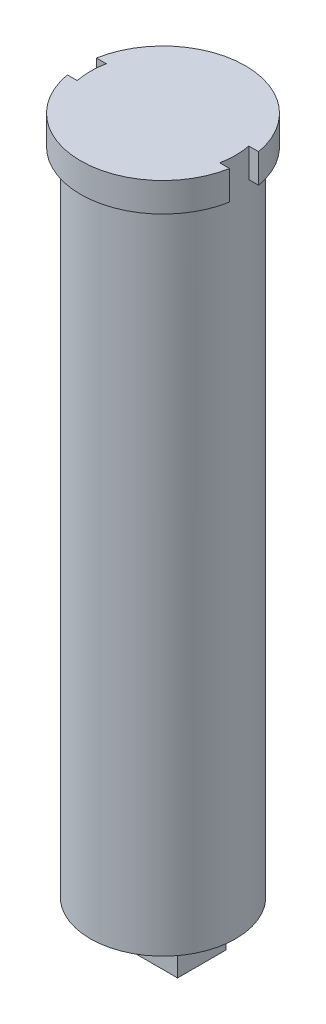
ISO-10303-21;
HEADER;
FILE_DESCRIPTION(('STEP AP214'),'2;1');
FILE_NAME('part.step','',(''),(''),'','','');
FILE_SCHEMA(('AUTOMOTIVE_DESIGN { 1 0 10303 214 1 1 1 1 }'));
ENDSEC;
DATA;
#1=APPLICATION_CONTEXT('core data for automotive mechanical design processes');
#2=APPLICATION_PROTOCOL_DEFINITION('international standard','automotive_design',2000,#1);
#3=PRODUCT_CONTEXT('',#1,'mechanical');
#4=PRODUCT('Part','Part','',(#3));
#5=PRODUCT_RELATED_PRODUCT_CATEGORY('part','',(#4));
#6=PRODUCT_DEFINITION_FORMATION('','',#4);
#7=PRODUCT_DEFINITION_CONTEXT('part definition',#1,'design');
#8=PRODUCT_DEFINITION('design','',#6,#7);
#9=PRODUCT_DEFINITION_SHAPE('','',#8);
#10=(LENGTH_UNIT() NAMED_UNIT(*) SI_UNIT(.MILLI.,.METRE.));
#11=(NAMED_UNIT(*) PLANE_ANGLE_UNIT() SI_UNIT($,.RADIAN.));
#12=(NAMED_UNIT(*) SI_UNIT($,.STERADIAN.) SOLID_ANGLE_UNIT());
#13=UNCERTAINTY_MEASURE_WITH_UNIT(LENGTH_MEASURE(1.E-05),#10,'distance_accuracy_value','');
#14=(GEOMETRIC_REPRESENTATION_CONTEXT(3) GLOBAL_UNCERTAINTY_ASSIGNED_CONTEXT((#13)) GLOBAL_UNIT_ASSIGNED_CONTEXT((#10,
#11,#12)) REPRESENTATION_CONTEXT('',''));
#15=CARTESIAN_POINT('',(0.,0.,0.));
#16=DIRECTION('',(0.,0.,1.));
#17=DIRECTION('',(1.,0.,0.));
#18=AXIS2_PLACEMENT_3D('',#15,#16,#17);
#19=CARTESIAN_POINT('',(0.,0.,0.));
#20=DIRECTION('',(0.,1.,0.));
#21=DIRECTION('',(0.,0.,1.));
#22=AXIS2_PLACEMENT_3D('',#19,#20,#21);
#23=PLANE('',#22);
#24=DIRECTION('',(1.,0.,0.));
#25=VECTOR('',#24,1.);
#26=CARTESIAN_POINT('',(7.34846922834953,0.,-1.5));
#27=LINE('',#26,#25);
#28=CARTESIAN_POINT('',(7.34846922834953,0.,-1.5));
#29=VERTEX_POINT('',#28);
#30=CARTESIAN_POINT('',(8.36660026534076,0.,-1.5));
#31=VERTEX_POINT('',#30);
#32=EDGE_CURVE('E172',#29,#31,#27,.T.);
#33=ORIENTED_EDGE('',*,*,#32,.F.);
#34=CARTESIAN_POINT('',(0.,0.,0.));
#35=DIRECTION('',(0.,1.,0.));
#36=DIRECTION('',(0.,0.,1.));
#37=AXIS2_PLACEMENT_3D('',#34,#35,#36);
#38=CIRCLE('',#37,7.5);
#39=CARTESIAN_POINT('',(-7.34846922834953,0.,-1.5));
#40=VERTEX_POINT('',#39);
#41=EDGE_CURVE('E11',#29,#40,#38,.T.);
#42=ORIENTED_EDGE('',*,*,#41,.T.);
#43=DIRECTION('',(1.,0.,0.));
#44=VECTOR('',#43,1.);
#45=CARTESIAN_POINT('',(-8.36660026534076,0.,-1.5));
#46=LINE('',#45,#44);
#47=CARTESIAN_POINT('',(-8.36660026534076,0.,-1.5));
#48=VERTEX_POINT('',#47);
#49=EDGE_CURVE('E189',#48,#40,#46,.T.);
#50=ORIENTED_EDGE('',*,*,#49,.F.);
#51=CARTESIAN_POINT('',(0.,0.,0.));
#52=DIRECTION('',(0.,1.,0.));
#53=DIRECTION('',(0.,0.,1.));
#54=AXIS2_PLACEMENT_3D('',#51,#52,#53);
#55=CIRCLE('',#54,8.5);
#56=EDGE_CURVE('E166',#31,#48,#55,.T.);
#57=ORIENTED_EDGE('',*,*,#56,.F.);
#58=EDGE_LOOP('',(#33,#42,#50,#57));
#59=FACE_BOUND('',#58,.T.);
#60=ADVANCED_FACE('F38',(#59),#23,.F.);
#61=CARTESIAN_POINT('',(0.,3.,0.));
#62=DIRECTION('',(0.,-1.,0.));
#63=DIRECTION('',(0.,0.,-1.));
#64=AXIS2_PLACEMENT_3D('',#61,#62,#63);
#65=CYLINDRICAL_SURFACE('',#64,8.5);
#66=ORIENTED_EDGE('',*,*,#56,.T.);
#67=DIRECTION('',(0.,-1.,0.));
#68=VECTOR('',#67,1.);
#69=CARTESIAN_POINT('',(-8.36660026534076,3.,-1.5));
#70=LINE('',#69,#68);
#71=CARTESIAN_POINT('',(-8.36660026534076,3.,-1.5));
#72=VERTEX_POINT('',#71);
#73=EDGE_CURVE('E42',#72,#48,#70,.T.);
#74=ORIENTED_EDGE('',*,*,#73,.F.);
#75=CARTESIAN_POINT('',(0.,3.,0.));
#76=DIRECTION('',(0.,1.,0.));
#77=DIRECTION('',(0.,0.,1.));
#78=AXIS2_PLACEMENT_3D('',#75,#76,#77);
#79=CIRCLE('',#78,8.5);
#80=CARTESIAN_POINT('',(8.36660026534076,3.,-1.5));
#81=VERTEX_POINT('',#80);
#82=EDGE_CURVE('E168',#81,#72,#79,.T.);
#83=ORIENTED_EDGE('',*,*,#82,.F.);
#84=DIRECTION('',(0.,-1.,0.));
#85=VECTOR('',#84,1.);
#86=CARTESIAN_POINT('',(8.36660026534076,3.,-1.5));
#87=LINE('',#86,#85);
#88=EDGE_CURVE('E186',#81,#31,#87,.T.);
#89=ORIENTED_EDGE('',*,*,#88,.T.);
#90=EDGE_LOOP('',(#66,#74,#83,#89));
#91=FACE_BOUND('',#90,.T.);
#92=ADVANCED_FACE('F40',(#91),#65,.T.);
#93=CARTESIAN_POINT('',(-8.36660026534076,3.,-1.5));
#94=DIRECTION('',(0.,0.,-1.));
#95=DIRECTION('',(-1.,0.,0.));
#96=AXIS2_PLACEMENT_3D('',#93,#94,#95);
#97=PLANE('',#96);
#98=ORIENTED_EDGE('',*,*,#49,.T.);
#99=DIRECTION('',(0.,-1.,0.));
#100=VECTOR('',#99,1.);
#101=CARTESIAN_POINT('',(-7.34846922834953,3.,-1.5));
#102=LINE('',#101,#100);
#103=CARTESIAN_POINT('',(-7.34846922834953,3.,-1.5));
#104=VERTEX_POINT('',#103);
#105=EDGE_CURVE('E216',#104,#40,#102,.T.);
#106=ORIENTED_EDGE('',*,*,#105,.F.);
#107=DIRECTION('',(1.,0.,0.));
#108=VECTOR('',#107,1.);
#109=CARTESIAN_POINT('',(-8.36660026534076,3.,-1.5));
#110=LINE('',#109,#108);
#111=EDGE_CURVE('E171',#72,#104,#110,.T.);
#112=ORIENTED_EDGE('',*,*,#111,.F.);
#113=ORIENTED_EDGE('',*,*,#73,.T.);
#114=EDGE_LOOP('',(#98,#106,#112,#113));
#115=FACE_BOUND('',#114,.T.);
#116=ADVANCED_FACE('F250',(#115),#97,.F.);
#117=CARTESIAN_POINT('',(-8.36660026534076,3.,1.5));
#118=DIRECTION('',(0.,0.,1.));
#119=DIRECTION('',(1.,0.,0.));
#120=AXIS2_PLACEMENT_3D('',#117,#118,#119);
#121=PLANE('',#120);
#122=DIRECTION('',(-1.,0.,0.));
#123=VECTOR('',#122,1.);
#124=CARTESIAN_POINT('',(-8.36660026534076,0.,1.5));
#125=LINE('',#124,#123);
#126=CARTESIAN_POINT('',(-7.34846922834953,0.,1.5));
#127=VERTEX_POINT('',#126);
#128=CARTESIAN_POINT('',(-8.36660026534076,0.,1.5));
#129=VERTEX_POINT('',#128);
#130=EDGE_CURVE('E192',#127,#129,#125,.T.);
#131=ORIENTED_EDGE('',*,*,#130,.T.);
#132=DIRECTION('',(0.,-1.,0.));
#133=VECTOR('',#132,1.);
#134=CARTESIAN_POINT('',(-8.36660026534076,3.,1.5));
#135=LINE('',#134,#133);
#136=CARTESIAN_POINT('',(-8.36660026534076,3.,1.5));
#137=VERTEX_POINT('',#136);
#138=EDGE_CURVE('E211',#137,#129,#135,.T.);
#139=ORIENTED_EDGE('',*,*,#138,.F.);
#140=DIRECTION('',(-1.,0.,0.));
#141=VECTOR('',#140,1.);
#142=CARTESIAN_POINT('',(-8.36660026534076,3.,1.5));
#143=LINE('',#142,#141);
#144=CARTESIAN_POINT('',(-7.34846922834954,3.,1.5));
#145=VERTEX_POINT('',#144);
#146=EDGE_CURVE('E176',#145,#137,#143,.T.);
#147=ORIENTED_EDGE('',*,*,#146,.F.);
#148=DIRECTION('',(0.,-1.,0.));
#149=VECTOR('',#148,1.);
#150=CARTESIAN_POINT('',(-7.34846922834954,3.,1.5));
#151=LINE('',#150,#149);
#152=EDGE_CURVE('E214',#145,#127,#151,.T.);
#153=ORIENTED_EDGE('',*,*,#152,.T.);
#154=EDGE_LOOP('',(#131,#139,#147,#153));
#155=FACE_BOUND('',#154,.T.);
#156=ADVANCED_FACE('F248',(#155),#121,.F.);
#157=CARTESIAN_POINT('',(0.,3.,0.));
#158=DIRECTION('',(0.,-1.,0.));
#159=DIRECTION('',(0.,0.,-1.));
#160=AXIS2_PLACEMENT_3D('',#157,#158,#159);
#161=CYLINDRICAL_SURFACE('',#160,8.5);
#162=CARTESIAN_POINT('',(0.,0.,0.));
#163=DIRECTION('',(0.,1.,0.));
#164=DIRECTION('',(0.,0.,1.));
#165=AXIS2_PLACEMENT_3D('',#162,#163,#164);
#166=CIRCLE('',#165,8.5);
#167=CARTESIAN_POINT('',(8.36660026534076,0.,1.5));
#168=VERTEX_POINT('',#167);
#169=EDGE_CURVE('E194',#129,#168,#166,.T.);
#170=ORIENTED_EDGE('',*,*,#169,.T.);
#171=DIRECTION('',(0.,-1.,0.));
#172=VECTOR('',#171,1.);
#173=CARTESIAN_POINT('',(8.36660026534076,3.,1.5));
#174=LINE('',#173,#172);
#175=CARTESIAN_POINT('',(8.36660026534076,3.,1.5));
#176=VERTEX_POINT('',#175);
#177=EDGE_CURVE('E208',#176,#168,#174,.T.);
#178=ORIENTED_EDGE('',*,*,#177,.F.);
#179=CARTESIAN_POINT('',(0.,3.,0.));
#180=DIRECTION('',(0.,1.,0.));
#181=DIRECTION('',(0.,0.,1.));
#182=AXIS2_PLACEMENT_3D('',#179,#180,#181);
#183=CIRCLE('',#182,8.5);
#184=EDGE_CURVE('E178',#137,#176,#183,.T.);
#185=ORIENTED_EDGE('',*,*,#184,.F.);
#186=ORIENTED_EDGE('',*,*,#138,.T.);
#187=EDGE_LOOP('',(#170,#178,#185,#186));
#188=FACE_BOUND('',#187,.T.);
#189=ADVANCED_FACE('F246',(#188),#161,.T.);
#190=CARTESIAN_POINT('',(7.34846922834953,3.,1.5));
#191=DIRECTION('',(0.,0.,1.));
#192=DIRECTION('',(1.,0.,0.));
#193=AXIS2_PLACEMENT_3D('',#190,#191,#192);
#194=PLANE('',#193);
#195=DIRECTION('',(-1.,0.,0.));
#196=VECTOR('',#195,1.);
#197=CARTESIAN_POINT('',(7.34846922834953,0.,1.5));
#198=LINE('',#197,#196);
#199=CARTESIAN_POINT('',(7.34846922834953,0.,1.5));
#200=VERTEX_POINT('',#199);
#201=EDGE_CURVE('E196',#168,#200,#198,.T.);
#202=ORIENTED_EDGE('',*,*,#201,.T.);
#203=DIRECTION('',(0.,-1.,0.));
#204=VECTOR('',#203,1.);
#205=CARTESIAN_POINT('',(7.34846922834953,3.,1.5));
#206=LINE('',#205,#204);
#207=CARTESIAN_POINT('',(7.34846922834953,3.,1.5));
#208=VERTEX_POINT('',#207);
#209=EDGE_CURVE('E205',#208,#200,#206,.T.);
#210=ORIENTED_EDGE('',*,*,#209,.F.);
#211=DIRECTION('',(-1.,0.,0.));
#212=VECTOR('',#211,1.);
#213=CARTESIAN_POINT('',(7.34846922834953,3.,1.5));
#214=LINE('',#213,#212);
#215=EDGE_CURVE('E180',#176,#208,#214,.T.);
#216=ORIENTED_EDGE('',*,*,#215,.F.);
#217=ORIENTED_EDGE('',*,*,#177,.T.);
#218=EDGE_LOOP('',(#202,#210,#216,#217));
#219=FACE_BOUND('',#218,.T.);
#220=ADVANCED_FACE('F232',(#219),#194,.F.);
#221=CARTESIAN_POINT('',(0.,3.,0.));
#222=DIRECTION('',(0.,-1.,0.));
#223=DIRECTION('',(0.,0.,-1.));
#224=AXIS2_PLACEMENT_3D('',#221,#222,#223);
#225=CYLINDRICAL_SURFACE('',#224,7.5);
#226=CARTESIAN_POINT('',(0.,-67.,0.));
#227=DIRECTION('',(0.,1.,0.));
#228=DIRECTION('',(0.,0.,1.));
#229=AXIS2_PLACEMENT_3D('',#226,#227,#228);
#230=CIRCLE('',#229,7.5);
#231=CARTESIAN_POINT('',(0.,-67.,7.5));
#232=VERTEX_POINT('',#231);
#233=EDGE_CURVE('E135',#232,#232,#230,.T.);
#234=ORIENTED_EDGE('',*,*,#233,.T.);
#235=EDGE_LOOP('',(#234));
#236=FACE_BOUND('',#235,.T.);
#237=ORIENTED_EDGE('',*,*,#209,.T.);
#238=EDGE_CURVE('E47',#127,#200,#38,.T.);
#239=ORIENTED_EDGE('',*,*,#238,.F.);
#240=ORIENTED_EDGE('',*,*,#152,.F.);
#241=CARTESIAN_POINT('',(0.,3.,0.));
#242=DIRECTION('',(0.,1.,0.));
#243=DIRECTION('',(0.,0.,1.));
#244=AXIS2_PLACEMENT_3D('',#241,#242,#243);
#245=CIRCLE('',#244,7.5);
#246=EDGE_CURVE('E174',#104,#145,#245,.T.);
#247=ORIENTED_EDGE('',*,*,#246,.F.);
#248=ORIENTED_EDGE('',*,*,#105,.T.);
#249=ORIENTED_EDGE('',*,*,#41,.F.);
#250=DIRECTION('',(0.,-1.,0.));
#251=VECTOR('',#250,1.);
#252=CARTESIAN_POINT('',(7.34846922834953,3.,-1.5));
#253=LINE('',#252,#251);
#254=CARTESIAN_POINT('',(7.34846922834953,3.,-1.5));
#255=VERTEX_POINT('',#254);
#256=EDGE_CURVE('E202',#255,#29,#253,.T.);
#257=ORIENTED_EDGE('',*,*,#256,.F.);
#258=CARTESIAN_POINT('',(0.,3.,0.));
#259=DIRECTION('',(0.,1.,0.));
#260=DIRECTION('',(0.,0.,1.));
#261=AXIS2_PLACEMENT_3D('',#258,#259,#260);
#262=CIRCLE('',#261,7.5);
#263=EDGE_CURVE('E182',#208,#255,#262,.T.);
#264=ORIENTED_EDGE('',*,*,#263,.F.);
#265=EDGE_LOOP('',(#237,#239,#240,#247,#248,#249,#257,#264));
#266=FACE_BOUND('',#265,.T.);
#267=ADVANCED_FACE('F236',(#236,#266),#225,.T.);
#268=CARTESIAN_POINT('',(7.34846922834953,3.,-1.5));
#269=DIRECTION('',(0.,0.,-1.));
#270=DIRECTION('',(-1.,0.,0.));
#271=AXIS2_PLACEMENT_3D('',#268,#269,#270);
#272=PLANE('',#271);
#273=ORIENTED_EDGE('',*,*,#32,.T.);
#274=ORIENTED_EDGE('',*,*,#88,.F.);
#275=DIRECTION('',(1.,0.,0.));
#276=VECTOR('',#275,1.);
#277=CARTESIAN_POINT('',(7.34846922834953,3.,-1.5));
#278=LINE('',#277,#276);
#279=EDGE_CURVE('E184',#255,#81,#278,.T.);
#280=ORIENTED_EDGE('',*,*,#279,.F.);
#281=ORIENTED_EDGE('',*,*,#256,.T.);
#282=EDGE_LOOP('',(#273,#274,#280,#281));
#283=FACE_BOUND('',#282,.T.);
#284=ADVANCED_FACE('F255',(#283),#272,.F.);
#285=CARTESIAN_POINT('',(0.,3.,0.));
#286=DIRECTION('',(0.,1.,0.));
#287=DIRECTION('',(0.,0.,1.));
#288=AXIS2_PLACEMENT_3D('',#285,#286,#287);
#289=PLANE('',#288);
#290=ORIENTED_EDGE('',*,*,#82,.T.);
#291=ORIENTED_EDGE('',*,*,#111,.T.);
#292=ORIENTED_EDGE('',*,*,#246,.T.);
#293=ORIENTED_EDGE('',*,*,#146,.T.);
#294=ORIENTED_EDGE('',*,*,#184,.T.);
#295=ORIENTED_EDGE('',*,*,#215,.T.);
#296=ORIENTED_EDGE('',*,*,#263,.T.);
#297=ORIENTED_EDGE('',*,*,#279,.T.);
#298=EDGE_LOOP('',(#290,#291,#292,#293,#294,#295,#296,#297));
#299=FACE_BOUND('',#298,.T.);
#300=ADVANCED_FACE('F240',(#299),#289,.T.);
#301=ORIENTED_EDGE('',*,*,#130,.F.);
#302=ORIENTED_EDGE('',*,*,#238,.T.);
#303=ORIENTED_EDGE('',*,*,#201,.F.);
#304=ORIENTED_EDGE('',*,*,#169,.F.);
#305=EDGE_LOOP('',(#301,#302,#303,#304));
#306=FACE_BOUND('',#305,.T.);
#307=ADVANCED_FACE('F227',(#306),#23,.F.);
#308=CARTESIAN_POINT('',(0.,-67.,0.));
#309=DIRECTION('',(0.,1.,0.));
#310=DIRECTION('',(0.,0.,1.));
#311=AXIS2_PLACEMENT_3D('',#308,#309,#310);
#312=PLANE('',#311);
#313=DIRECTION('',(1.,0.,0.));
#314=VECTOR('',#313,1.);
#315=CARTESIAN_POINT('',(0.,-67.,-2.5));
#316=LINE('',#315,#314);
#317=CARTESIAN_POINT('',(-4.,-67.,-2.5));
#318=VERTEX_POINT('',#317);
#319=CARTESIAN_POINT('',(4.,-67.,-2.5));
#320=VERTEX_POINT('',#319);
#321=EDGE_CURVE('E157',#318,#320,#316,.T.);
#322=ORIENTED_EDGE('',*,*,#321,.F.);
#323=DIRECTION('',(0.,0.,1.));
#324=VECTOR('',#323,1.);
#325=CARTESIAN_POINT('',(-4.,-67.,0.));
#326=LINE('',#325,#324);
#327=CARTESIAN_POINT('',(-4.,-67.,2.5));
#328=VERTEX_POINT('',#327);
#329=EDGE_CURVE('E55',#318,#328,#326,.T.);
#330=ORIENTED_EDGE('',*,*,#329,.T.);
#331=DIRECTION('',(1.,0.,0.));
#332=VECTOR('',#331,1.);
#333=CARTESIAN_POINT('',(0.,-67.,2.5));
#334=LINE('',#333,#332);
#335=CARTESIAN_POINT('',(4.,-67.,2.5));
#336=VERTEX_POINT('',#335);
#337=EDGE_CURVE('E60',#328,#336,#334,.T.);
#338=ORIENTED_EDGE('',*,*,#337,.T.);
#339=DIRECTION('',(0.,0.,1.));
#340=VECTOR('',#339,1.);
#341=CARTESIAN_POINT('',(4.,-67.,0.));
#342=LINE('',#341,#340);
#343=EDGE_CURVE('E150',#320,#336,#342,.T.);
#344=ORIENTED_EDGE('',*,*,#343,.F.);
#345=EDGE_LOOP('',(#322,#330,#338,#344));
#346=FACE_BOUND('',#345,.T.);
#347=ORIENTED_EDGE('',*,*,#233,.F.);
#348=EDGE_LOOP('',(#347));
#349=FACE_BOUND('',#348,.T.);
#350=ADVANCED_FACE('F268',(#346,#349),#312,.F.);
#351=CARTESIAN_POINT('',(-4.,-71.,0.));
#352=DIRECTION('',(-1.,0.,0.));
#353=DIRECTION('',(0.,0.,1.));
#354=AXIS2_PLACEMENT_3D('',#351,#352,#353);
#355=PLANE('',#354);
#356=ORIENTED_EDGE('',*,*,#329,.F.);
#357=DIRECTION('',(0.,1.,0.));
#358=VECTOR('',#357,1.);
#359=CARTESIAN_POINT('',(-4.,-71.,-2.5));
#360=LINE('',#359,#358);
#361=CARTESIAN_POINT('',(-4.,-71.,-2.5));
#362=VERTEX_POINT('',#361);
#363=EDGE_CURVE('E127',#362,#318,#360,.T.);
#364=ORIENTED_EDGE('',*,*,#363,.F.);
#365=DIRECTION('',(0.,0.,1.));
#366=VECTOR('',#365,1.);
#367=CARTESIAN_POINT('',(-4.,-71.,0.));
#368=LINE('',#367,#366);
#369=CARTESIAN_POINT('',(-4.,-71.,2.5));
#370=VERTEX_POINT('',#369);
#371=EDGE_CURVE('E131',#362,#370,#368,.T.);
#372=ORIENTED_EDGE('',*,*,#371,.T.);
#373=DIRECTION('',(0.,1.,0.));
#374=VECTOR('',#373,1.);
#375=CARTESIAN_POINT('',(-4.,-71.,2.5));
#376=LINE('',#375,#374);
#377=EDGE_CURVE('E155',#370,#328,#376,.T.);
#378=ORIENTED_EDGE('',*,*,#377,.T.);
#379=EDGE_LOOP('',(#356,#364,#372,#378));
#380=FACE_BOUND('',#379,.T.);
#381=ADVANCED_FACE('F129',(#380),#355,.T.);
#382=CARTESIAN_POINT('',(0.,-71.,-2.5));
#383=DIRECTION('',(0.,0.,1.));
#384=DIRECTION('',(1.,0.,0.));
#385=AXIS2_PLACEMENT_3D('',#382,#383,#384);
#386=PLANE('',#385);
#387=ORIENTED_EDGE('',*,*,#321,.T.);
#388=DIRECTION('',(0.,1.,0.));
#389=VECTOR('',#388,1.);
#390=CARTESIAN_POINT('',(4.,-71.,-2.5));
#391=LINE('',#390,#389);
#392=CARTESIAN_POINT('',(4.,-71.,-2.5));
#393=VERTEX_POINT('',#392);
#394=EDGE_CURVE('E136',#393,#320,#391,.T.);
#395=ORIENTED_EDGE('',*,*,#394,.F.);
#396=DIRECTION('',(1.,0.,0.));
#397=VECTOR('',#396,1.);
#398=CARTESIAN_POINT('',(0.,-71.,-2.5));
#399=LINE('',#398,#397);
#400=EDGE_CURVE('E139',#362,#393,#399,.T.);
#401=ORIENTED_EDGE('',*,*,#400,.F.);
#402=ORIENTED_EDGE('',*,*,#363,.T.);
#403=EDGE_LOOP('',(#387,#395,#401,#402));
#404=FACE_BOUND('',#403,.T.);
#405=ADVANCED_FACE('F140',(#404),#386,.F.);
#406=CARTESIAN_POINT('',(4.,-71.,0.));
#407=DIRECTION('',(-1.,0.,0.));
#408=DIRECTION('',(0.,0.,1.));
#409=AXIS2_PLACEMENT_3D('',#406,#407,#408);
#410=PLANE('',#409);
#411=ORIENTED_EDGE('',*,*,#343,.T.);
#412=DIRECTION('',(0.,1.,0.));
#413=VECTOR('',#412,1.);
#414=CARTESIAN_POINT('',(4.,-71.,2.5));
#415=LINE('',#414,#413);
#416=CARTESIAN_POINT('',(4.,-71.,2.5));
#417=VERTEX_POINT('',#416);
#418=EDGE_CURVE('E162',#417,#336,#415,.T.);
#419=ORIENTED_EDGE('',*,*,#418,.F.);
#420=DIRECTION('',(0.,0.,1.));
#421=VECTOR('',#420,1.);
#422=CARTESIAN_POINT('',(4.,-71.,0.));
#423=LINE('',#422,#421);
#424=EDGE_CURVE('E144',#393,#417,#423,.T.);
#425=ORIENTED_EDGE('',*,*,#424,.F.);
#426=ORIENTED_EDGE('',*,*,#394,.T.);
#427=EDGE_LOOP('',(#411,#419,#425,#426));
#428=FACE_BOUND('',#427,.T.);
#429=ADVANCED_FACE('F282',(#428),#410,.F.);
#430=CARTESIAN_POINT('',(0.,-71.,2.5));
#431=DIRECTION('',(0.,0.,1.));
#432=DIRECTION('',(1.,0.,0.));
#433=AXIS2_PLACEMENT_3D('',#430,#431,#432);
#434=PLANE('',#433);
#435=ORIENTED_EDGE('',*,*,#337,.F.);
#436=ORIENTED_EDGE('',*,*,#377,.F.);
#437=DIRECTION('',(1.,0.,0.));
#438=VECTOR('',#437,1.);
#439=CARTESIAN_POINT('',(0.,-71.,2.5));
#440=LINE('',#439,#438);
#441=EDGE_CURVE('E148',#370,#417,#440,.T.);
#442=ORIENTED_EDGE('',*,*,#441,.T.);
#443=ORIENTED_EDGE('',*,*,#418,.T.);
#444=EDGE_LOOP('',(#435,#436,#442,#443));
#445=FACE_BOUND('',#444,.T.);
#446=ADVANCED_FACE('F285',(#445),#434,.T.);
#447=CARTESIAN_POINT('',(0.,-71.,0.));
#448=DIRECTION('',(0.,-1.,0.));
#449=DIRECTION('',(0.,0.,-1.));
#450=AXIS2_PLACEMENT_3D('',#447,#448,#449);
#451=PLANE('',#450);
#452=ORIENTED_EDGE('',*,*,#371,.F.);
#453=ORIENTED_EDGE('',*,*,#400,.T.);
#454=ORIENTED_EDGE('',*,*,#424,.T.);
#455=ORIENTED_EDGE('',*,*,#441,.F.);
#456=EDGE_LOOP('',(#452,#453,#454,#455));
#457=FACE_BOUND('',#456,.T.);
#458=ADVANCED_FACE('F146',(#457),#451,.T.);
#459=CLOSED_SHELL('',(#60,#92,#116,#156,#189,#220,#267,#284,#300,#307,#350,#381,#405,#429,#446,#458));
#460=MANIFOLD_SOLID_BREP('B2',#459);
#461=ADVANCED_BREP_SHAPE_REPRESENTATION('',(#18,#460),#14);
#462=SHAPE_DEFINITION_REPRESENTATION(#9,#461);
ENDSEC;
END-ISO-10303-21;
